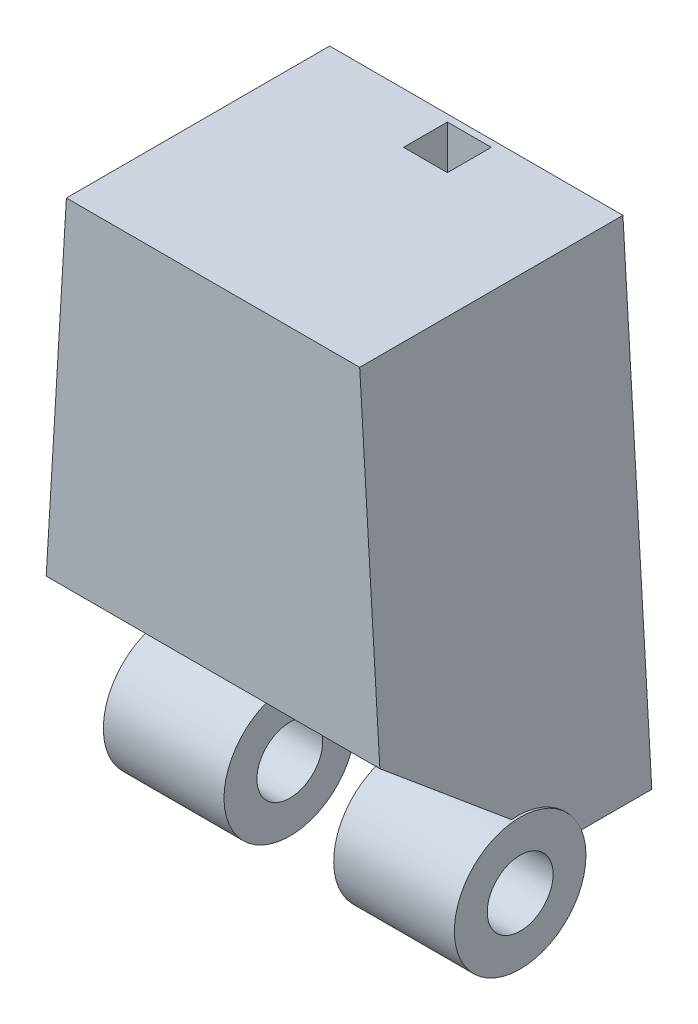
ISO-10303-21;
HEADER;
FILE_DESCRIPTION(('STEP AP214'),'2;1');
FILE_NAME('part.step','',(''),(''),'','','');
FILE_SCHEMA(('AUTOMOTIVE_DESIGN { 1 0 10303 214 1 1 1 1 }'));
ENDSEC;
DATA;
#1=APPLICATION_CONTEXT('core data for automotive mechanical design processes');
#2=APPLICATION_PROTOCOL_DEFINITION('international standard','automotive_design',2000,#1);
#3=PRODUCT_CONTEXT('',#1,'mechanical');
#4=PRODUCT('Part','Part','',(#3));
#5=PRODUCT_RELATED_PRODUCT_CATEGORY('part','',(#4));
#6=PRODUCT_DEFINITION_FORMATION('','',#4);
#7=PRODUCT_DEFINITION_CONTEXT('part definition',#1,'design');
#8=PRODUCT_DEFINITION('design','',#6,#7);
#9=PRODUCT_DEFINITION_SHAPE('','',#8);
#10=(LENGTH_UNIT() NAMED_UNIT(*) SI_UNIT(.MILLI.,.METRE.));
#11=(NAMED_UNIT(*) PLANE_ANGLE_UNIT() SI_UNIT($,.RADIAN.));
#12=(NAMED_UNIT(*) SI_UNIT($,.STERADIAN.) SOLID_ANGLE_UNIT());
#13=UNCERTAINTY_MEASURE_WITH_UNIT(LENGTH_MEASURE(1.E-05),#10,'distance_accuracy_value','');
#14=(GEOMETRIC_REPRESENTATION_CONTEXT(3) GLOBAL_UNCERTAINTY_ASSIGNED_CONTEXT((#13)) GLOBAL_UNIT_ASSIGNED_CONTEXT((#10,
#11,#12)) REPRESENTATION_CONTEXT('',''));
#15=CARTESIAN_POINT('',(0.,0.,0.));
#16=DIRECTION('',(0.,0.,1.));
#17=DIRECTION('',(1.,0.,0.));
#18=AXIS2_PLACEMENT_3D('',#15,#16,#17);
#19=CARTESIAN_POINT('',(-56.5742777997626,0.,12.));
#20=DIRECTION('',(0.,1.,0.));
#21=DIRECTION('',(0.,0.,1.));
#22=AXIS2_PLACEMENT_3D('',#19,#20,#21);
#23=PLANE('',#22);
#24=DIRECTION('',(-1.,0.,0.));
#25=VECTOR('',#24,1.);
#26=CARTESIAN_POINT('',(-40.5742777997626,0.,3.20894285260943));
#27=LINE('',#26,#25);
#28=CARTESIAN_POINT('',(-56.5742777997626,0.,3.20894285260943));
#29=VERTEX_POINT('',#28);
#30=CARTESIAN_POINT('',(-51.0742777997626,0.,3.20894285260943));
#31=VERTEX_POINT('',#30);
#32=EDGE_CURVE('E250',#29,#31,#27,.F.);
#33=ORIENTED_EDGE('',*,*,#32,.F.);
#34=DIRECTION('',(0.,0.,-1.));
#35=VECTOR('',#34,1.);
#36=CARTESIAN_POINT('',(-56.5742777997626,0.,12.));
#37=LINE('',#36,#35);
#38=CARTESIAN_POINT('',(-56.5742777997626,0.,0.));
#39=VERTEX_POINT('',#38);
#40=EDGE_CURVE('E284',#29,#39,#37,.T.);
#41=ORIENTED_EDGE('',*,*,#40,.T.);
#42=DIRECTION('',(1.,0.,0.));
#43=VECTOR('',#42,1.);
#44=CARTESIAN_POINT('',(-56.5742777997626,0.,0.));
#45=LINE('',#44,#43);
#46=CARTESIAN_POINT('',(-40.5742777997626,0.,0.));
#47=VERTEX_POINT('',#46);
#48=EDGE_CURVE('E273',#39,#47,#45,.T.);
#49=ORIENTED_EDGE('',*,*,#48,.T.);
#50=DIRECTION('',(0.,0.,-1.));
#51=VECTOR('',#50,1.);
#52=CARTESIAN_POINT('',(-40.5742777997626,0.,12.));
#53=LINE('',#52,#51);
#54=CARTESIAN_POINT('',(-40.5742777997626,0.,3.20894285260943));
#55=VERTEX_POINT('',#54);
#56=EDGE_CURVE('E282',#55,#47,#53,.T.);
#57=ORIENTED_EDGE('',*,*,#56,.F.);
#58=CARTESIAN_POINT('',(-46.0742777997626,0.,3.20894285260943));
#59=VERTEX_POINT('',#58);
#60=EDGE_CURVE('E249',#59,#55,#27,.F.);
#61=ORIENTED_EDGE('',*,*,#60,.F.);
#62=EDGE_CURVE('E254',#31,#59,#27,.F.);
#63=ORIENTED_EDGE('',*,*,#62,.F.);
#64=EDGE_LOOP('',(#33,#41,#49,#57,#61,#63));
#65=FACE_BOUND('',#64,.T.);
#66=DIRECTION('',(0.,0.,-1.));
#67=VECTOR('',#66,1.);
#68=CARTESIAN_POINT('',(-49.5742777997626,0.,2.316111107882));
#69=LINE('',#68,#67);
#70=CARTESIAN_POINT('',(-49.5742777997626,0.,2.316111107882));
#71=VERTEX_POINT('',#70);
#72=CARTESIAN_POINT('',(-49.5742777997626,0.,0.316111107881998));
#73=VERTEX_POINT('',#72);
#74=EDGE_CURVE('E160',#71,#73,#69,.T.);
#75=ORIENTED_EDGE('',*,*,#74,.F.);
#76=DIRECTION('',(1.,0.,0.));
#77=VECTOR('',#76,1.);
#78=CARTESIAN_POINT('',(-49.5742777997626,0.,2.316111107882));
#79=LINE('',#78,#77);
#80=CARTESIAN_POINT('',(-47.5742777997626,0.,2.316111107882));
#81=VERTEX_POINT('',#80);
#82=EDGE_CURVE('E168',#71,#81,#79,.T.);
#83=ORIENTED_EDGE('',*,*,#82,.T.);
#84=DIRECTION('',(0.,0.,-1.));
#85=VECTOR('',#84,1.);
#86=CARTESIAN_POINT('',(-47.5742777997626,0.,2.316111107882));
#87=LINE('',#86,#85);
#88=CARTESIAN_POINT('',(-47.5742777997626,0.,0.316111107881998));
#89=VERTEX_POINT('',#88);
#90=EDGE_CURVE('E179',#81,#89,#87,.T.);
#91=ORIENTED_EDGE('',*,*,#90,.T.);
#92=DIRECTION('',(1.,0.,0.));
#93=VECTOR('',#92,1.);
#94=CARTESIAN_POINT('',(-49.5742777997626,0.,0.316111107881998));
#95=LINE('',#94,#93);
#96=EDGE_CURVE('E172',#73,#89,#95,.T.);
#97=ORIENTED_EDGE('',*,*,#96,.F.);
#98=EDGE_LOOP('',(#75,#83,#91,#97));
#99=FACE_BOUND('',#98,.T.);
#100=ADVANCED_FACE('F44',(#65,#99),#23,.F.);
#101=CARTESIAN_POINT('',(-56.5742777997626,22.,12.));
#102=DIRECTION('',(0.,-1.,0.));
#103=DIRECTION('',(0.,0.,-1.));
#104=AXIS2_PLACEMENT_3D('',#101,#102,#103);
#105=PLANE('',#104);
#106=DIRECTION('',(1.,0.,0.));
#107=VECTOR('',#106,1.);
#108=CARTESIAN_POINT('',(-56.5742777997626,22.,12.));
#109=LINE('',#108,#107);
#110=CARTESIAN_POINT('',(-55.2586799133808,22.,12.));
#111=VERTEX_POINT('',#110);
#112=CARTESIAN_POINT('',(-41.8898756861443,22.,12.));
#113=VERTEX_POINT('',#112);
#114=EDGE_CURVE('E181',#111,#113,#109,.T.);
#115=ORIENTED_EDGE('',*,*,#114,.T.);
#116=DIRECTION('',(0.,0.,-1.));
#117=VECTOR('',#116,1.);
#118=CARTESIAN_POINT('',(-41.8898756861443,22.,12.));
#119=LINE('',#118,#117);
#120=CARTESIAN_POINT('',(-41.8898756861443,22.,0.));
#121=VERTEX_POINT('',#120);
#122=EDGE_CURVE('E280',#113,#121,#119,.T.);
#123=ORIENTED_EDGE('',*,*,#122,.T.);
#124=DIRECTION('',(1.,0.,0.));
#125=VECTOR('',#124,1.);
#126=CARTESIAN_POINT('',(-48.5742777997626,22.,0.));
#127=LINE('',#126,#125);
#128=CARTESIAN_POINT('',(-55.2586799133808,22.,0.));
#129=VERTEX_POINT('',#128);
#130=EDGE_CURVE('E297',#129,#121,#127,.T.);
#131=ORIENTED_EDGE('',*,*,#130,.F.);
#132=DIRECTION('',(0.,0.,-1.));
#133=VECTOR('',#132,1.);
#134=CARTESIAN_POINT('',(-55.2586799133808,22.,12.));
#135=LINE('',#134,#133);
#136=EDGE_CURVE('E270',#111,#129,#135,.T.);
#137=ORIENTED_EDGE('',*,*,#136,.F.);
#138=EDGE_LOOP('',(#115,#123,#131,#137));
#139=FACE_BOUND('',#138,.T.);
#140=DIRECTION('',(0.,0.,1.));
#141=VECTOR('',#140,1.);
#142=CARTESIAN_POINT('',(-49.5742777997626,22.,12.));
#143=LINE('',#142,#141);
#144=CARTESIAN_POINT('',(-49.5742777997626,22.,0.316111107881998));
#145=VERTEX_POINT('',#144);
#146=CARTESIAN_POINT('',(-49.5742777997626,22.,2.316111107882));
#147=VERTEX_POINT('',#146);
#148=EDGE_CURVE('E11',#145,#147,#143,.T.);
#149=ORIENTED_EDGE('',*,*,#148,.F.);
#150=DIRECTION('',(1.,0.,0.));
#151=VECTOR('',#150,1.);
#152=CARTESIAN_POINT('',(-56.5742777997626,22.,0.316111107881998));
#153=LINE('',#152,#151);
#154=CARTESIAN_POINT('',(-47.5742777997626,22.,0.316111107881998));
#155=VERTEX_POINT('',#154);
#156=EDGE_CURVE('E52',#145,#155,#153,.T.);
#157=ORIENTED_EDGE('',*,*,#156,.T.);
#158=DIRECTION('',(0.,0.,1.));
#159=VECTOR('',#158,1.);
#160=CARTESIAN_POINT('',(-47.5742777997626,22.,12.));
#161=LINE('',#160,#159);
#162=CARTESIAN_POINT('',(-47.5742777997626,22.,2.316111107882));
#163=VERTEX_POINT('',#162);
#164=EDGE_CURVE('E300',#155,#163,#161,.T.);
#165=ORIENTED_EDGE('',*,*,#164,.T.);
#166=DIRECTION('',(-1.,0.,0.));
#167=VECTOR('',#166,1.);
#168=CARTESIAN_POINT('',(-56.5742777997626,22.,2.316111107882));
#169=LINE('',#168,#167);
#170=EDGE_CURVE('E303',#163,#147,#169,.T.);
#171=ORIENTED_EDGE('',*,*,#170,.T.);
#172=EDGE_LOOP('',(#149,#157,#165,#171));
#173=FACE_BOUND('',#172,.T.);
#174=ADVANCED_FACE('F306',(#139,#173),#105,.F.);
#175=CARTESIAN_POINT('',(-56.5742777997626,-1.96433929006934,1.62400644488252));
#176=DIRECTION('',(0.,0.770712909441233,-0.637182557216242));
#177=DIRECTION('',(0.,0.637182557216242,0.770712909441233));
#178=AXIS2_PLACEMENT_3D('',#175,#176,#177);
#179=PLANE('',#178);
#180=DIRECTION('',(-1.,0.,0.));
#181=VECTOR('',#180,1.);
#182=CARTESIAN_POINT('',(-40.5742777997626,1.88670778135651,6.28209329801413));
#183=LINE('',#182,#181);
#184=CARTESIAN_POINT('',(-40.687102743825,1.88670778135651,6.28209329801413));
#185=VERTEX_POINT('',#184);
#186=CARTESIAN_POINT('',(-46.0742777997626,1.88670778135651,6.28209329801413));
#187=VERTEX_POINT('',#186);
#188=EDGE_CURVE('E290',#185,#187,#183,.T.);
#189=ORIENTED_EDGE('',*,*,#188,.F.);
#190=DIRECTION('',(0.0380758250929246,-0.636720506102474,-0.770154029173452));
#191=VECTOR('',#190,1.);
#192=CARTESIAN_POINT('',(-40.8088718006379,3.92298290585744,8.74509782921682));
#193=LINE('',#192,#191);
#194=CARTESIAN_POINT('',(-40.9697916699819,6.6139549439046,12.));
#195=VERTEX_POINT('',#194);
#196=EDGE_CURVE('E257',#195,#185,#193,.T.);
#197=ORIENTED_EDGE('',*,*,#196,.F.);
#198=DIRECTION('',(-1.,0.,0.));
#199=VECTOR('',#198,1.);
#200=CARTESIAN_POINT('',(-48.5742777997626,6.6139549439046,12.));
#201=LINE('',#200,#199);
#202=CARTESIAN_POINT('',(-56.1787639295432,6.61395494390459,12.));
#203=VERTEX_POINT('',#202);
#204=EDGE_CURVE('E286',#195,#203,#201,.T.);
#205=ORIENTED_EDGE('',*,*,#204,.T.);
#206=DIRECTION('',(0.0380758250929246,0.636720506102474,0.770154029173452));
#207=VECTOR('',#206,1.);
#208=CARTESIAN_POINT('',(-56.3396837988872,3.92298290585744,8.74509782921682));
#209=LINE('',#208,#207);
#210=CARTESIAN_POINT('',(-56.4614528557002,1.88670778135651,6.28209329801413));
#211=VERTEX_POINT('',#210);
#212=EDGE_CURVE('E260',#211,#203,#209,.T.);
#213=ORIENTED_EDGE('',*,*,#212,.F.);
#214=CARTESIAN_POINT('',(-51.0742777997626,1.88670778135651,6.28209329801413));
#215=VERTEX_POINT('',#214);
#216=EDGE_CURVE('E289',#215,#211,#183,.T.);
#217=ORIENTED_EDGE('',*,*,#216,.F.);
#218=EDGE_CURVE('E294',#187,#215,#183,.T.);
#219=ORIENTED_EDGE('',*,*,#218,.F.);
#220=EDGE_LOOP('',(#189,#197,#205,#213,#217,#219));
#221=FACE_BOUND('',#220,.T.);
#222=DIRECTION('',(0.,-0.637182557216242,-0.770712909441233));
#223=VECTOR('',#222,1.);
#224=CARTESIAN_POINT('',(-53.5742777997626,2.61388104101718,7.16165569700607));
#225=LINE('',#224,#223);
#226=CARTESIAN_POINT('',(-53.5742777997626,5.79979382709839,11.0152202442122));
#227=VERTEX_POINT('',#226);
#228=CARTESIAN_POINT('',(-53.5742777997626,2.61388104101718,7.16165569700607));
#229=VERTEX_POINT('',#228);
#230=EDGE_CURVE('E198',#227,#229,#225,.T.);
#231=ORIENTED_EDGE('',*,*,#230,.F.);
#232=DIRECTION('',(1.,0.,0.));
#233=VECTOR('',#232,1.);
#234=CARTESIAN_POINT('',(-53.5742777997626,5.79979382709839,11.0152202442122));
#235=LINE('',#234,#233);
#236=CARTESIAN_POINT('',(-43.5742777997626,5.79979382709839,11.0152202442122));
#237=VERTEX_POINT('',#236);
#238=EDGE_CURVE('E215',#227,#237,#235,.T.);
#239=ORIENTED_EDGE('',*,*,#238,.T.);
#240=DIRECTION('',(0.,-0.637182557216242,-0.770712909441233));
#241=VECTOR('',#240,1.);
#242=CARTESIAN_POINT('',(-43.5742777997626,2.61388104101718,7.16165569700607));
#243=LINE('',#242,#241);
#244=CARTESIAN_POINT('',(-43.5742777997626,2.61388104101718,7.16165569700607));
#245=VERTEX_POINT('',#244);
#246=EDGE_CURVE('E192',#237,#245,#243,.T.);
#247=ORIENTED_EDGE('',*,*,#246,.T.);
#248=DIRECTION('',(1.,0.,0.));
#249=VECTOR('',#248,1.);
#250=CARTESIAN_POINT('',(-53.5742777997626,2.61388104101718,7.16165569700607));
#251=LINE('',#250,#249);
#252=EDGE_CURVE('E211',#229,#245,#251,.T.);
#253=ORIENTED_EDGE('',*,*,#252,.F.);
#254=EDGE_LOOP('',(#231,#239,#247,#253));
#255=FACE_BOUND('',#254,.T.);
#256=ADVANCED_FACE('F322',(#221,#255),#179,.F.);
#257=CARTESIAN_POINT('',(-40.5742777997626,-1.1,6.));
#258=DIRECTION('',(-1.,0.,0.));
#259=DIRECTION('',(0.,0.,1.));
#260=AXIS2_PLACEMENT_3D('',#257,#258,#259);
#261=CYLINDRICAL_SURFACE('',#260,3.);
#262=CARTESIAN_POINT('',(-51.0742777997626,-1.1,6.));
#263=DIRECTION('',(1.,0.,0.));
#264=DIRECTION('',(0.,0.,-1.));
#265=AXIS2_PLACEMENT_3D('',#262,#263,#264);
#266=CIRCLE('',#265,3.);
#267=EDGE_CURVE('E225',#215,#31,#266,.T.);
#268=ORIENTED_EDGE('',*,*,#267,.F.);
#269=ORIENTED_EDGE('',*,*,#216,.T.);
#270=CARTESIAN_POINT('',(-56.6400576940817,-1.1,6.));
#271=DIRECTION('',(0.998216766991548,-0.0596932667638598,0.));
#272=DIRECTION('',(-0.0596932667638598,-0.998216766991548,0.));
#273=AXIS2_PLACEMENT_3D('',#270,#271,#272);
#274=ELLIPSE('',#273,3.00535925582725,3.);
#275=EDGE_CURVE('E253',#211,#29,#274,.F.);
#276=ORIENTED_EDGE('',*,*,#275,.T.);
#277=CARTESIAN_POINT('',(-56.5742777997626,-1.1,6.));
#278=DIRECTION('',(1.,0.,0.));
#279=DIRECTION('',(0.,0.,-1.));
#280=AXIS2_PLACEMENT_3D('',#277,#278,#279);
#281=CIRCLE('',#280,3.);
#282=EDGE_CURVE('E228',#29,#29,#281,.T.);
#283=ORIENTED_EDGE('',*,*,#282,.T.);
#284=ORIENTED_EDGE('',*,*,#32,.T.);
#285=EDGE_LOOP('',(#268,#269,#276,#283,#284));
#286=FACE_BOUND('',#285,.T.);
#287=ADVANCED_FACE('F341',(#286),#261,.T.);
#288=CARTESIAN_POINT('',(-40.5742777997626,-1.1,6.));
#289=DIRECTION('',(-1.,0.,0.));
#290=DIRECTION('',(0.,0.,1.));
#291=AXIS2_PLACEMENT_3D('',#288,#289,#290);
#292=CYLINDRICAL_SURFACE('',#291,1.5);
#293=CARTESIAN_POINT('',(-56.5742777997626,-1.1,6.));
#294=DIRECTION('',(1.,0.,0.));
#295=DIRECTION('',(0.,0.,-1.));
#296=AXIS2_PLACEMENT_3D('',#293,#294,#295);
#297=CIRCLE('',#296,1.5);
#298=CARTESIAN_POINT('',(-56.5742777997626,-1.1,4.5));
#299=VERTEX_POINT('',#298);
#300=EDGE_CURVE('E239',#299,#299,#297,.T.);
#301=ORIENTED_EDGE('',*,*,#300,.F.);
#302=EDGE_LOOP('',(#301));
#303=FACE_BOUND('',#302,.T.);
#304=CARTESIAN_POINT('',(-51.0742777997626,-1.1,6.));
#305=DIRECTION('',(1.,0.,0.));
#306=DIRECTION('',(0.,0.,-1.));
#307=AXIS2_PLACEMENT_3D('',#304,#305,#306);
#308=CIRCLE('',#307,1.5);
#309=CARTESIAN_POINT('',(-51.0742777997626,-1.1,4.5));
#310=VERTEX_POINT('',#309);
#311=EDGE_CURVE('E224',#310,#310,#308,.T.);
#312=ORIENTED_EDGE('',*,*,#311,.T.);
#313=EDGE_LOOP('',(#312));
#314=FACE_BOUND('',#313,.T.);
#315=ADVANCED_FACE('F351',(#303,#314),#292,.F.);
#316=CARTESIAN_POINT('',(-56.5742777997626,0.,12.));
#317=DIRECTION('',(0.998216766991548,-0.0596932667638598,0.));
#318=DIRECTION('',(0.0596932667638598,0.998216766991548,0.));
#319=AXIS2_PLACEMENT_3D('',#316,#317,#318);
#320=PLANE('',#319);
#321=ORIENTED_EDGE('',*,*,#275,.F.);
#322=ORIENTED_EDGE('',*,*,#212,.T.);
#323=DIRECTION('',(-0.0596932667638598,-0.998216766991548,0.));
#324=VECTOR('',#323,1.);
#325=CARTESIAN_POINT('',(-56.5742777997626,0.,12.));
#326=LINE('',#325,#324);
#327=EDGE_CURVE('E263',#111,#203,#326,.T.);
#328=ORIENTED_EDGE('',*,*,#327,.F.);
#329=ORIENTED_EDGE('',*,*,#136,.T.);
#330=DIRECTION('',(-0.0596932667638598,-0.998216766991548,0.));
#331=VECTOR('',#330,1.);
#332=CARTESIAN_POINT('',(-56.5742777997626,0.,0.));
#333=LINE('',#332,#331);
#334=EDGE_CURVE('E262',#129,#39,#333,.T.);
#335=ORIENTED_EDGE('',*,*,#334,.T.);
#336=ORIENTED_EDGE('',*,*,#40,.F.);
#337=EDGE_LOOP('',(#321,#322,#328,#329,#335,#336));
#338=FACE_BOUND('',#337,.T.);
#339=ADVANCED_FACE('F46',(#338),#320,.F.);
#340=CARTESIAN_POINT('',(-40.5742777997626,0.,12.));
#341=DIRECTION('',(-0.998216766991548,-0.0596932667638598,0.));
#342=DIRECTION('',(0.0596932667638598,-0.998216766991548,0.));
#343=AXIS2_PLACEMENT_3D('',#340,#341,#342);
#344=PLANE('',#343);
#345=CARTESIAN_POINT('',(-40.5084979054435,-1.1,6.));
#346=DIRECTION('',(-0.998216766991548,-0.0596932667638598,0.));
#347=DIRECTION('',(-0.0596932667638598,0.998216766991548,0.));
#348=AXIS2_PLACEMENT_3D('',#345,#346,#347);
#349=ELLIPSE('',#348,3.00535925582725,3.);
#350=EDGE_CURVE('E242',#55,#185,#349,.F.);
#351=ORIENTED_EDGE('',*,*,#350,.F.);
#352=ORIENTED_EDGE('',*,*,#56,.T.);
#353=DIRECTION('',(-0.0596932667638598,0.998216766991548,0.));
#354=VECTOR('',#353,1.);
#355=CARTESIAN_POINT('',(-40.5742777997626,0.,0.));
#356=LINE('',#355,#354);
#357=EDGE_CURVE('E267',#47,#121,#356,.T.);
#358=ORIENTED_EDGE('',*,*,#357,.T.);
#359=ORIENTED_EDGE('',*,*,#122,.F.);
#360=DIRECTION('',(-0.0596932667638598,0.998216766991548,0.));
#361=VECTOR('',#360,1.);
#362=CARTESIAN_POINT('',(-40.5742777997626,0.,12.));
#363=LINE('',#362,#361);
#364=EDGE_CURVE('E266',#195,#113,#363,.T.);
#365=ORIENTED_EDGE('',*,*,#364,.F.);
#366=ORIENTED_EDGE('',*,*,#196,.T.);
#367=EDGE_LOOP('',(#351,#352,#358,#359,#365,#366));
#368=FACE_BOUND('',#367,.T.);
#369=ADVANCED_FACE('F326',(#368),#344,.F.);
#370=CARTESIAN_POINT('',(-48.5742777997626,22.,12.));
#371=DIRECTION('',(0.,0.,1.));
#372=DIRECTION('',(1.,0.,0.));
#373=AXIS2_PLACEMENT_3D('',#370,#371,#372);
#374=PLANE('',#373);
#375=ORIENTED_EDGE('',*,*,#114,.F.);
#376=ORIENTED_EDGE('',*,*,#327,.T.);
#377=ORIENTED_EDGE('',*,*,#204,.F.);
#378=ORIENTED_EDGE('',*,*,#364,.T.);
#379=EDGE_LOOP('',(#375,#376,#377,#378));
#380=FACE_BOUND('',#379,.T.);
#381=ADVANCED_FACE('F329',(#380),#374,.T.);
#382=CARTESIAN_POINT('',(-48.5742777997626,22.,0.));
#383=DIRECTION('',(0.,0.,1.));
#384=DIRECTION('',(1.,0.,0.));
#385=AXIS2_PLACEMENT_3D('',#382,#383,#384);
#386=PLANE('',#385);
#387=ORIENTED_EDGE('',*,*,#334,.F.);
#388=ORIENTED_EDGE('',*,*,#130,.T.);
#389=ORIENTED_EDGE('',*,*,#357,.F.);
#390=ORIENTED_EDGE('',*,*,#48,.F.);
#391=EDGE_LOOP('',(#387,#388,#389,#390));
#392=FACE_BOUND('',#391,.T.);
#393=ADVANCED_FACE('F331',(#392),#386,.F.);
#394=ORIENTED_EDGE('',*,*,#188,.T.);
#395=CARTESIAN_POINT('',(-46.0742777997626,-1.1,6.));
#396=DIRECTION('',(1.,0.,0.));
#397=DIRECTION('',(0.,0.,-1.));
#398=AXIS2_PLACEMENT_3D('',#395,#396,#397);
#399=CIRCLE('',#398,3.);
#400=EDGE_CURVE('E214',#187,#59,#399,.T.);
#401=ORIENTED_EDGE('',*,*,#400,.T.);
#402=ORIENTED_EDGE('',*,*,#60,.T.);
#403=CARTESIAN_POINT('',(-40.5742777997626,-1.1,6.));
#404=DIRECTION('',(1.,0.,0.));
#405=DIRECTION('',(0.,0.,-1.));
#406=AXIS2_PLACEMENT_3D('',#403,#404,#405);
#407=CIRCLE('',#406,3.);
#408=EDGE_CURVE('E235',#55,#55,#407,.T.);
#409=ORIENTED_EDGE('',*,*,#408,.F.);
#410=ORIENTED_EDGE('',*,*,#350,.T.);
#411=EDGE_LOOP('',(#394,#401,#402,#409,#410));
#412=FACE_BOUND('',#411,.T.);
#413=ADVANCED_FACE('F334',(#412),#261,.T.);
#414=CARTESIAN_POINT('',(-46.0742777997626,-1.1,6.));
#415=DIRECTION('',(1.,0.,0.));
#416=DIRECTION('',(0.,0.,-1.));
#417=AXIS2_PLACEMENT_3D('',#414,#415,#416);
#418=CIRCLE('',#417,1.5);
#419=CARTESIAN_POINT('',(-46.0742777997626,-1.1,4.5));
#420=VERTEX_POINT('',#419);
#421=EDGE_CURVE('E232',#420,#420,#418,.T.);
#422=ORIENTED_EDGE('',*,*,#421,.F.);
#423=EDGE_LOOP('',(#422));
#424=FACE_BOUND('',#423,.T.);
#425=CARTESIAN_POINT('',(-40.5742777997626,-1.1,6.));
#426=DIRECTION('',(1.,0.,0.));
#427=DIRECTION('',(0.,0.,-1.));
#428=AXIS2_PLACEMENT_3D('',#425,#426,#427);
#429=CIRCLE('',#428,1.5);
#430=CARTESIAN_POINT('',(-40.5742777997626,-1.1,4.5));
#431=VERTEX_POINT('',#430);
#432=EDGE_CURVE('E238',#431,#431,#429,.T.);
#433=ORIENTED_EDGE('',*,*,#432,.T.);
#434=EDGE_LOOP('',(#433));
#435=FACE_BOUND('',#434,.T.);
#436=ADVANCED_FACE('F345',(#424,#435),#292,.F.);
#437=CARTESIAN_POINT('',(-40.5742777997626,0.,0.));
#438=DIRECTION('',(1.,0.,0.));
#439=DIRECTION('',(0.,0.,-1.));
#440=AXIS2_PLACEMENT_3D('',#437,#438,#439);
#441=PLANE('',#440);
#442=ORIENTED_EDGE('',*,*,#408,.T.);
#443=EDGE_LOOP('',(#442));
#444=FACE_BOUND('',#443,.T.);
#445=ORIENTED_EDGE('',*,*,#432,.F.);
#446=EDGE_LOOP('',(#445));
#447=FACE_BOUND('',#446,.T.);
#448=ADVANCED_FACE('F349',(#444,#447),#441,.T.);
#449=CARTESIAN_POINT('',(-56.5742777997626,0.,0.));
#450=DIRECTION('',(1.,0.,0.));
#451=DIRECTION('',(0.,0.,-1.));
#452=AXIS2_PLACEMENT_3D('',#449,#450,#451);
#453=PLANE('',#452);
#454=ORIENTED_EDGE('',*,*,#282,.F.);
#455=EDGE_LOOP('',(#454));
#456=FACE_BOUND('',#455,.T.);
#457=ORIENTED_EDGE('',*,*,#300,.T.);
#458=EDGE_LOOP('',(#457));
#459=FACE_BOUND('',#458,.T.);
#460=ADVANCED_FACE('F352',(#456,#459),#453,.F.);
#461=CARTESIAN_POINT('',(-51.0742777997626,-1.1,6.));
#462=DIRECTION('',(1.,0.,0.));
#463=DIRECTION('',(0.,0.,-1.));
#464=AXIS2_PLACEMENT_3D('',#461,#462,#463);
#465=CYLINDRICAL_SURFACE('',#464,3.);
#466=EDGE_CURVE('E229',#59,#187,#399,.T.);
#467=ORIENTED_EDGE('',*,*,#466,.T.);
#468=ORIENTED_EDGE('',*,*,#218,.T.);
#469=EDGE_CURVE('E221',#31,#215,#266,.T.);
#470=ORIENTED_EDGE('',*,*,#469,.F.);
#471=ORIENTED_EDGE('',*,*,#62,.T.);
#472=EDGE_LOOP('',(#467,#468,#470,#471));
#473=FACE_BOUND('',#472,.T.);
#474=ADVANCED_FACE('F355',(#473),#465,.F.);
#475=CARTESIAN_POINT('',(-51.0742777997626,0.,0.));
#476=DIRECTION('',(1.,0.,0.));
#477=DIRECTION('',(0.,0.,-1.));
#478=AXIS2_PLACEMENT_3D('',#475,#476,#477);
#479=PLANE('',#478);
#480=ORIENTED_EDGE('',*,*,#469,.T.);
#481=ORIENTED_EDGE('',*,*,#267,.T.);
#482=EDGE_LOOP('',(#480,#481));
#483=FACE_BOUND('',#482,.T.);
#484=ORIENTED_EDGE('',*,*,#311,.F.);
#485=EDGE_LOOP('',(#484));
#486=FACE_BOUND('',#485,.T.);
#487=ADVANCED_FACE('F362',(#483,#486),#479,.T.);
#488=CARTESIAN_POINT('',(-46.0742777997626,0.,0.));
#489=DIRECTION('',(1.,0.,0.));
#490=DIRECTION('',(0.,0.,-1.));
#491=AXIS2_PLACEMENT_3D('',#488,#489,#490);
#492=PLANE('',#491);
#493=ORIENTED_EDGE('',*,*,#466,.F.);
#494=ORIENTED_EDGE('',*,*,#400,.F.);
#495=EDGE_LOOP('',(#493,#494));
#496=FACE_BOUND('',#495,.T.);
#497=ORIENTED_EDGE('',*,*,#421,.T.);
#498=EDGE_LOOP('',(#497));
#499=FACE_BOUND('',#498,.T.);
#500=ADVANCED_FACE('F364',(#496,#499),#492,.F.);
#501=CARTESIAN_POINT('',(-53.5742777997626,2.61388104101718,7.16165569700607));
#502=DIRECTION('',(0.,-0.637182557216242,-0.770712909441233));
#503=DIRECTION('',(0.,0.770712909441233,-0.637182557216242));
#504=AXIS2_PLACEMENT_3D('',#501,#502,#503);
#505=PLANE('',#504);
#506=DIRECTION('',(0.,0.770712909441233,-0.637182557216243));
#507=VECTOR('',#506,1.);
#508=CARTESIAN_POINT('',(-43.5742777997626,2.61388104101718,7.16165569700607));
#509=LINE('',#508,#507);
#510=CARTESIAN_POINT('',(-43.5742777997626,6.46744558822334,3.97574291092486));
#511=VERTEX_POINT('',#510);
#512=EDGE_CURVE('E187',#245,#511,#509,.T.);
#513=ORIENTED_EDGE('',*,*,#512,.T.);
#514=DIRECTION('',(1.,0.,0.));
#515=VECTOR('',#514,1.);
#516=CARTESIAN_POINT('',(-53.5742777997626,6.46744558822334,3.97574291092486));
#517=LINE('',#516,#515);
#518=CARTESIAN_POINT('',(-53.5742777997626,6.46744558822334,3.97574291092486));
#519=VERTEX_POINT('',#518);
#520=EDGE_CURVE('E201',#519,#511,#517,.T.);
#521=ORIENTED_EDGE('',*,*,#520,.F.);
#522=DIRECTION('',(0.,0.770712909441233,-0.637182557216243));
#523=VECTOR('',#522,1.);
#524=CARTESIAN_POINT('',(-53.5742777997626,2.61388104101718,7.16165569700607));
#525=LINE('',#524,#523);
#526=EDGE_CURVE('E188',#229,#519,#525,.T.);
#527=ORIENTED_EDGE('',*,*,#526,.F.);
#528=ORIENTED_EDGE('',*,*,#252,.T.);
#529=EDGE_LOOP('',(#513,#521,#527,#528));
#530=FACE_BOUND('',#529,.T.);
#531=ADVANCED_FACE('F367',(#530),#505,.F.);
#532=CARTESIAN_POINT('',(-53.5742777997626,9.65335837430456,7.82930745813102));
#533=DIRECTION('',(0.,0.637182557216242,0.770712909441233));
#534=DIRECTION('',(0.,-0.770712909441233,0.637182557216243));
#535=AXIS2_PLACEMENT_3D('',#532,#533,#534);
#536=PLANE('',#535);
#537=DIRECTION('',(0.,-0.770712909441233,0.637182557216242));
#538=VECTOR('',#537,1.);
#539=CARTESIAN_POINT('',(-43.5742777997626,9.65335837430456,7.82930745813102));
#540=LINE('',#539,#538);
#541=CARTESIAN_POINT('',(-43.5742777997626,9.65335837430456,7.82930745813102));
#542=VERTEX_POINT('',#541);
#543=EDGE_CURVE('E207',#542,#237,#540,.T.);
#544=ORIENTED_EDGE('',*,*,#543,.T.);
#545=ORIENTED_EDGE('',*,*,#238,.F.);
#546=DIRECTION('',(0.,-0.770712909441233,0.637182557216242));
#547=VECTOR('',#546,1.);
#548=CARTESIAN_POINT('',(-53.5742777997626,9.65335837430456,7.82930745813102));
#549=LINE('',#548,#547);
#550=CARTESIAN_POINT('',(-53.5742777997626,9.65335837430456,7.82930745813102));
#551=VERTEX_POINT('',#550);
#552=EDGE_CURVE('E195',#551,#227,#549,.T.);
#553=ORIENTED_EDGE('',*,*,#552,.F.);
#554=DIRECTION('',(1.,0.,0.));
#555=VECTOR('',#554,1.);
#556=CARTESIAN_POINT('',(-53.5742777997626,9.65335837430456,7.82930745813102));
#557=LINE('',#556,#555);
#558=EDGE_CURVE('E218',#551,#542,#557,.T.);
#559=ORIENTED_EDGE('',*,*,#558,.T.);
#560=EDGE_LOOP('',(#544,#545,#553,#559));
#561=FACE_BOUND('',#560,.T.);
#562=ADVANCED_FACE('F374',(#561),#536,.F.);
#563=CARTESIAN_POINT('',(-53.5742777997626,6.46744558822334,3.97574291092486));
#564=DIRECTION('',(0.,0.770712909441232,-0.637182557216243));
#565=DIRECTION('',(0.,0.637182557216243,0.770712909441232));
#566=AXIS2_PLACEMENT_3D('',#563,#564,#565);
#567=PLANE('',#566);
#568=DIRECTION('',(0.,0.637182557216243,0.770712909441232));
#569=VECTOR('',#568,1.);
#570=CARTESIAN_POINT('',(-43.5742777997626,6.46744558822334,3.97574291092486));
#571=LINE('',#570,#569);
#572=EDGE_CURVE('E204',#511,#542,#571,.T.);
#573=ORIENTED_EDGE('',*,*,#572,.T.);
#574=ORIENTED_EDGE('',*,*,#558,.F.);
#575=DIRECTION('',(0.,0.637182557216243,0.770712909441232));
#576=VECTOR('',#575,1.);
#577=CARTESIAN_POINT('',(-53.5742777997626,6.46744558822334,3.97574291092486));
#578=LINE('',#577,#576);
#579=EDGE_CURVE('E191',#519,#551,#578,.T.);
#580=ORIENTED_EDGE('',*,*,#579,.F.);
#581=ORIENTED_EDGE('',*,*,#520,.T.);
#582=EDGE_LOOP('',(#573,#574,#580,#581));
#583=FACE_BOUND('',#582,.T.);
#584=ADVANCED_FACE('F376',(#583),#567,.F.);
#585=CARTESIAN_POINT('',(-53.5742777997626,0.,0.));
#586=DIRECTION('',(1.,0.,0.));
#587=DIRECTION('',(0.,0.,-1.));
#588=AXIS2_PLACEMENT_3D('',#585,#586,#587);
#589=PLANE('',#588);
#590=CARTESIAN_POINT('',(-53.5742777997626,6.17711363623363,7.54809025596646));
#591=DIRECTION('',(1.,0.,0.));
#592=DIRECTION('',(0.,0.,-1.));
#593=AXIS2_PLACEMENT_3D('',#590,#591,#592);
#594=CIRCLE('',#593,1.5);
#595=CARTESIAN_POINT('',(-53.5742777997626,6.17711363623363,6.04809025596646));
#596=VERTEX_POINT('',#595);
#597=EDGE_CURVE('E184',#596,#596,#594,.F.);
#598=ORIENTED_EDGE('',*,*,#597,.T.);
#599=EDGE_LOOP('',(#598));
#600=FACE_BOUND('',#599,.T.);
#601=ORIENTED_EDGE('',*,*,#526,.T.);
#602=ORIENTED_EDGE('',*,*,#579,.T.);
#603=ORIENTED_EDGE('',*,*,#552,.T.);
#604=ORIENTED_EDGE('',*,*,#230,.T.);
#605=EDGE_LOOP('',(#601,#602,#603,#604));
#606=FACE_BOUND('',#605,.T.);
#607=ADVANCED_FACE('F379',(#600,#606),#589,.T.);
#608=CARTESIAN_POINT('',(-43.5742777997626,0.,0.));
#609=DIRECTION('',(1.,0.,0.));
#610=DIRECTION('',(0.,0.,-1.));
#611=AXIS2_PLACEMENT_3D('',#608,#609,#610);
#612=PLANE('',#611);
#613=CARTESIAN_POINT('',(-43.5742777997626,6.17711363623363,7.54809025596646));
#614=DIRECTION('',(1.,0.,0.));
#615=DIRECTION('',(0.,0.,-1.));
#616=AXIS2_PLACEMENT_3D('',#613,#614,#615);
#617=CIRCLE('',#616,1.5);
#618=CARTESIAN_POINT('',(-43.5742777997626,6.17711363623363,6.04809025596646));
#619=VERTEX_POINT('',#618);
#620=EDGE_CURVE('E293',#619,#619,#617,.F.);
#621=ORIENTED_EDGE('',*,*,#620,.F.);
#622=EDGE_LOOP('',(#621));
#623=FACE_BOUND('',#622,.T.);
#624=ORIENTED_EDGE('',*,*,#512,.F.);
#625=ORIENTED_EDGE('',*,*,#246,.F.);
#626=ORIENTED_EDGE('',*,*,#543,.F.);
#627=ORIENTED_EDGE('',*,*,#572,.F.);
#628=EDGE_LOOP('',(#624,#625,#626,#627));
#629=FACE_BOUND('',#628,.T.);
#630=ADVANCED_FACE('F384',(#623,#629),#612,.F.);
#631=CARTESIAN_POINT('',(-43.0742777997626,6.17711363623363,7.54809025596646));
#632=DIRECTION('',(-1.,0.,0.));
#633=DIRECTION('',(0.,0.,1.));
#634=AXIS2_PLACEMENT_3D('',#631,#632,#633);
#635=CYLINDRICAL_SURFACE('',#634,1.5);
#636=ORIENTED_EDGE('',*,*,#597,.F.);
#637=EDGE_LOOP('',(#636));
#638=FACE_BOUND('',#637,.T.);
#639=ORIENTED_EDGE('',*,*,#620,.T.);
#640=EDGE_LOOP('',(#639));
#641=FACE_BOUND('',#640,.T.);
#642=ADVANCED_FACE('F387',(#638,#641),#635,.T.);
#643=CARTESIAN_POINT('',(-49.5742777997626,0.,0.316111107881998));
#644=DIRECTION('',(0.,0.,-1.));
#645=DIRECTION('',(-1.,0.,0.));
#646=AXIS2_PLACEMENT_3D('',#643,#644,#645);
#647=PLANE('',#646);
#648=DIRECTION('',(0.,1.,0.));
#649=VECTOR('',#648,1.);
#650=CARTESIAN_POINT('',(-49.5742777997626,0.,0.316111107881998));
#651=LINE('',#650,#649);
#652=EDGE_CURVE('E165',#73,#145,#651,.T.);
#653=ORIENTED_EDGE('',*,*,#652,.F.);
#654=ORIENTED_EDGE('',*,*,#96,.T.);
#655=DIRECTION('',(0.,1.,0.));
#656=VECTOR('',#655,1.);
#657=CARTESIAN_POINT('',(-47.5742777997626,0.,0.316111107881998));
#658=LINE('',#657,#656);
#659=EDGE_CURVE('E59',#89,#155,#658,.T.);
#660=ORIENTED_EDGE('',*,*,#659,.T.);
#661=ORIENTED_EDGE('',*,*,#156,.F.);
#662=EDGE_LOOP('',(#653,#654,#660,#661));
#663=FACE_BOUND('',#662,.T.);
#664=ADVANCED_FACE('F308',(#663),#647,.F.);
#665=CARTESIAN_POINT('',(-49.5742777997626,23.3350990842824,2.316111107882));
#666=DIRECTION('',(0.,0.,1.));
#667=DIRECTION('',(1.,0.,0.));
#668=AXIS2_PLACEMENT_3D('',#665,#666,#667);
#669=PLANE('',#668);
#670=DIRECTION('',(0.,-1.,0.));
#671=VECTOR('',#670,1.);
#672=CARTESIAN_POINT('',(-47.5742777997626,23.3350990842824,2.316111107882));
#673=LINE('',#672,#671);
#674=EDGE_CURVE('E64',#163,#81,#673,.T.);
#675=ORIENTED_EDGE('',*,*,#674,.T.);
#676=ORIENTED_EDGE('',*,*,#82,.F.);
#677=DIRECTION('',(0.,-1.,0.));
#678=VECTOR('',#677,1.);
#679=CARTESIAN_POINT('',(-49.5742777997626,23.3350990842824,2.316111107882));
#680=LINE('',#679,#678);
#681=EDGE_CURVE('E155',#147,#71,#680,.T.);
#682=ORIENTED_EDGE('',*,*,#681,.F.);
#683=ORIENTED_EDGE('',*,*,#170,.F.);
#684=EDGE_LOOP('',(#675,#676,#682,#683));
#685=FACE_BOUND('',#684,.T.);
#686=ADVANCED_FACE('F169',(#685),#669,.F.);
#687=CARTESIAN_POINT('',(-49.5742777997626,0.,0.));
#688=DIRECTION('',(1.,0.,0.));
#689=DIRECTION('',(0.,0.,-1.));
#690=AXIS2_PLACEMENT_3D('',#687,#688,#689);
#691=PLANE('',#690);
#692=ORIENTED_EDGE('',*,*,#148,.T.);
#693=ORIENTED_EDGE('',*,*,#681,.T.);
#694=ORIENTED_EDGE('',*,*,#74,.T.);
#695=ORIENTED_EDGE('',*,*,#652,.T.);
#696=EDGE_LOOP('',(#692,#693,#694,#695));
#697=FACE_BOUND('',#696,.T.);
#698=ADVANCED_FACE('F157',(#697),#691,.T.);
#699=CARTESIAN_POINT('',(-47.5742777997626,0.,0.));
#700=DIRECTION('',(1.,0.,0.));
#701=DIRECTION('',(0.,0.,-1.));
#702=AXIS2_PLACEMENT_3D('',#699,#700,#701);
#703=PLANE('',#702);
#704=ORIENTED_EDGE('',*,*,#659,.F.);
#705=ORIENTED_EDGE('',*,*,#90,.F.);
#706=ORIENTED_EDGE('',*,*,#674,.F.);
#707=ORIENTED_EDGE('',*,*,#164,.F.);
#708=EDGE_LOOP('',(#704,#705,#706,#707));
#709=FACE_BOUND('',#708,.T.);
#710=ADVANCED_FACE('F309',(#709),#703,.F.);
#711=CLOSED_SHELL('',(#100,#174,#256,#287,#315,#339,#369,#381,#393,#413,#436,#448,#460,#474,
#487,#500,#531,#562,#584,#607,#630,#642,#664,#686,#698,#710));
#712=MANIFOLD_SOLID_BREP('B2',#711);
#713=ADVANCED_BREP_SHAPE_REPRESENTATION('',(#18,#712),#14);
#714=SHAPE_DEFINITION_REPRESENTATION(#9,#713);
ENDSEC;
END-ISO-10303-21;
